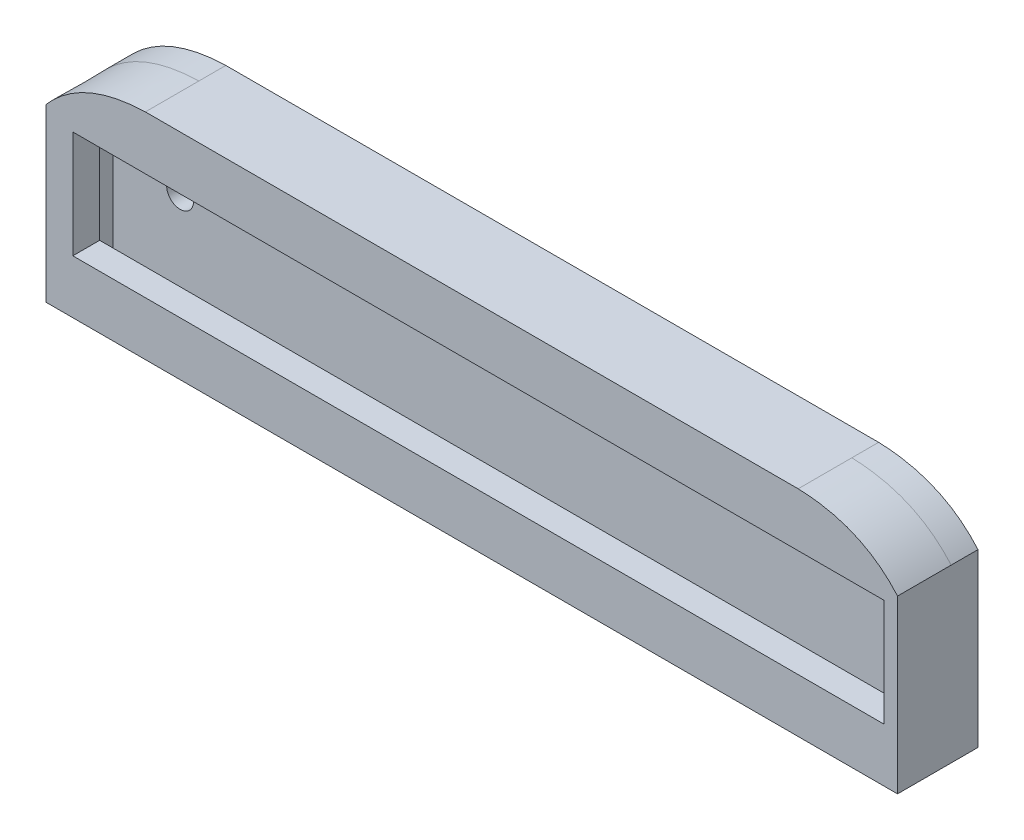
ISO-10303-21;
HEADER;
FILE_DESCRIPTION(('STEP AP214'),'2;1');
FILE_NAME('part.step','',(''),(''),'','','');
FILE_SCHEMA(('AUTOMOTIVE_DESIGN { 1 0 10303 214 1 1 1 1 }'));
ENDSEC;
DATA;
#1=APPLICATION_CONTEXT('core data for automotive mechanical design processes');
#2=APPLICATION_PROTOCOL_DEFINITION('international standard','automotive_design',2000,#1);
#3=PRODUCT_CONTEXT('',#1,'mechanical');
#4=PRODUCT('Part','Part','',(#3));
#5=PRODUCT_RELATED_PRODUCT_CATEGORY('part','',(#4));
#6=PRODUCT_DEFINITION_FORMATION('','',#4);
#7=PRODUCT_DEFINITION_CONTEXT('part definition',#1,'design');
#8=PRODUCT_DEFINITION('design','',#6,#7);
#9=PRODUCT_DEFINITION_SHAPE('','',#8);
#10=(LENGTH_UNIT() NAMED_UNIT(*) SI_UNIT(.MILLI.,.METRE.));
#11=(NAMED_UNIT(*) PLANE_ANGLE_UNIT() SI_UNIT($,.RADIAN.));
#12=(NAMED_UNIT(*) SI_UNIT($,.STERADIAN.) SOLID_ANGLE_UNIT());
#13=UNCERTAINTY_MEASURE_WITH_UNIT(LENGTH_MEASURE(1.E-05),#10,'distance_accuracy_value','');
#14=(GEOMETRIC_REPRESENTATION_CONTEXT(3) GLOBAL_UNCERTAINTY_ASSIGNED_CONTEXT((#13)) GLOBAL_UNIT_ASSIGNED_CONTEXT((#10,
#11,#12)) REPRESENTATION_CONTEXT('',''));
#15=CARTESIAN_POINT('',(0.,0.,0.));
#16=DIRECTION('',(0.,0.,1.));
#17=DIRECTION('',(1.,0.,0.));
#18=AXIS2_PLACEMENT_3D('',#15,#16,#17);
#19=CARTESIAN_POINT('',(31.2499999999999,-8.,2.));
#20=DIRECTION('',(0.,1.,0.));
#21=DIRECTION('',(0.,0.,1.));
#22=AXIS2_PLACEMENT_3D('',#19,#20,#21);
#23=PLANE('',#22);
#24=DIRECTION('',(1.,0.,0.));
#25=VECTOR('',#24,1.);
#26=CARTESIAN_POINT('',(31.2499999999999,-8.,0.));
#27=LINE('',#26,#25);
#28=CARTESIAN_POINT('',(-32.25,-8.,0.));
#29=VERTEX_POINT('',#28);
#30=CARTESIAN_POINT('',(31.2499999999999,-8.,0.));
#31=VERTEX_POINT('',#30);
#32=EDGE_CURVE('E436',#29,#31,#27,.T.);
#33=ORIENTED_EDGE('',*,*,#32,.T.);
#34=DIRECTION('',(0.,0.,-1.));
#35=VECTOR('',#34,1.);
#36=CARTESIAN_POINT('',(31.2499999999999,-8.,2.));
#37=LINE('',#36,#35);
#38=CARTESIAN_POINT('',(31.2499999999999,-8.,6.));
#39=VERTEX_POINT('',#38);
#40=EDGE_CURVE('E11',#39,#31,#37,.T.);
#41=ORIENTED_EDGE('',*,*,#40,.F.);
#42=DIRECTION('',(1.,0.,0.));
#43=VECTOR('',#42,1.);
#44=CARTESIAN_POINT('',(-32.25,-8.,6.));
#45=LINE('',#44,#43);
#46=CARTESIAN_POINT('',(-32.25,-8.,6.));
#47=VERTEX_POINT('',#46);
#48=EDGE_CURVE('E248',#47,#39,#45,.T.);
#49=ORIENTED_EDGE('',*,*,#48,.F.);
#50=DIRECTION('',(0.,0.,-1.));
#51=VECTOR('',#50,1.);
#52=CARTESIAN_POINT('',(-32.25,-8.,2.));
#53=LINE('',#52,#51);
#54=EDGE_CURVE('E438',#47,#29,#53,.T.);
#55=ORIENTED_EDGE('',*,*,#54,.T.);
#56=EDGE_LOOP('',(#33,#41,#49,#55));
#57=FACE_BOUND('',#56,.T.);
#58=ADVANCED_FACE('F41',(#57),#23,.F.);
#59=CARTESIAN_POINT('',(31.2499999999999,4.77723529661171,2.));
#60=DIRECTION('',(-1.,0.,0.));
#61=DIRECTION('',(0.,0.,1.));
#62=AXIS2_PLACEMENT_3D('',#59,#60,#61);
#63=PLANE('',#62);
#64=DIRECTION('',(0.,1.,0.));
#65=VECTOR('',#64,1.);
#66=CARTESIAN_POINT('',(31.2499999999999,4.77723529661171,0.));
#67=LINE('',#66,#65);
#68=CARTESIAN_POINT('',(31.2500000057796,4.77723529010021,0.));
#69=VERTEX_POINT('',#68);
#70=EDGE_CURVE('E440',#31,#69,#67,.T.);
#71=ORIENTED_EDGE('',*,*,#70,.T.);
#72=DIRECTION('',(0.,0.,-1.));
#73=VECTOR('',#72,1.);
#74=CARTESIAN_POINT('',(31.2500000057796,4.77723529010021,2.));
#75=LINE('',#74,#73);
#76=CARTESIAN_POINT('',(31.2500000057796,4.77723529010021,2.));
#77=VERTEX_POINT('',#76);
#78=EDGE_CURVE('E50',#77,#69,#75,.T.);
#79=ORIENTED_EDGE('',*,*,#78,.F.);
#80=DIRECTION('',(0.,0.,-1.));
#81=VECTOR('',#80,1.);
#82=CARTESIAN_POINT('',(31.2500000117157,4.77723528320106,4.));
#83=LINE('',#82,#81);
#84=CARTESIAN_POINT('',(31.2500000117157,4.77723528320106,6.));
#85=VERTEX_POINT('',#84);
#86=EDGE_CURVE('E441',#85,#77,#83,.T.);
#87=ORIENTED_EDGE('',*,*,#86,.F.);
#88=DIRECTION('',(9.01599712585994E-10,1.,0.));
#89=VECTOR('',#88,1.);
#90=CARTESIAN_POINT('',(31.2499999999999,-8.,6.));
#91=LINE('',#90,#89);
#92=EDGE_CURVE('E200',#39,#85,#91,.T.);
#93=ORIENTED_EDGE('',*,*,#92,.F.);
#94=ORIENTED_EDGE('',*,*,#40,.T.);
#95=EDGE_LOOP('',(#71,#79,#87,#93,#94));
#96=FACE_BOUND('',#95,.T.);
#97=ADVANCED_FACE('F427',(#96),#63,.F.);
#98=CARTESIAN_POINT('',(-571793.781585153,-820381.105272652,2.));
#99=CARTESIAN_POINT('',(575267.156620436,817992.669128069,2.));
#100=CARTESIAN_POINT('',(-578622.004023115,-815579.253240357,2.));
#101=B_SPLINE_CURVE_WITH_KNOTS('',2,(#98,#99,#100),.UNSPECIFIED.,.F.,.F.,(3,3),(0.,1.),.UNSPECIFIED.);
#102=DIRECTION('',(0.,0.,-1.));
#103=VECTOR('',#102,1.);
#104=SURFACE_OF_LINEAR_EXTRUSION('',#101,#103);
#105=CARTESIAN_POINT('',(-571793.781585153,-820381.105272652,0.));
#106=CARTESIAN_POINT('',(575267.156620436,817992.669128069,0.));
#107=CARTESIAN_POINT('',(-578622.004023115,-815579.253240357,0.));
#108=B_SPLINE_CURVE_WITH_KNOTS('',2,(#105,#106,#107),.UNSPECIFIED.,.F.,.F.,(3,3),(0.,1.),.UNSPECIFIED.);
#109=CARTESIAN_POINT('',(23.8400578712769,8.00000000000038,0.));
#110=VERTEX_POINT('',#109);
#111=EDGE_CURVE('E443',#69,#110,#108,.T.);
#112=ORIENTED_EDGE('',*,*,#111,.T.);
#113=DIRECTION('',(0.,0.,-1.));
#114=VECTOR('',#113,1.);
#115=CARTESIAN_POINT('',(23.8400578712769,8.00000000000038,2.));
#116=LINE('',#115,#114);
#117=CARTESIAN_POINT('',(23.8400578712769,8.00000000000038,2.));
#118=VERTEX_POINT('',#117);
#119=EDGE_CURVE('E477',#118,#110,#116,.T.);
#120=ORIENTED_EDGE('',*,*,#119,.F.);
#121=EDGE_CURVE('E471',#77,#118,#101,.T.);
#122=ORIENTED_EDGE('',*,*,#121,.F.);
#123=ORIENTED_EDGE('',*,*,#78,.T.);
#124=EDGE_LOOP('',(#112,#120,#122,#123));
#125=FACE_BOUND('',#124,.T.);
#126=ADVANCED_FACE('F433',(#125),#104,.F.);
#127=CARTESIAN_POINT('',(23.8400578712769,8.00000000000038,2.));
#128=DIRECTION('',(0.,-1.,0.));
#129=DIRECTION('',(1.,0.,0.));
#130=AXIS2_PLACEMENT_3D('',#127,#128,#129);
#131=PLANE('',#130);
#132=DIRECTION('',(-1.,0.,0.));
#133=VECTOR('',#132,1.);
#134=CARTESIAN_POINT('',(23.8400578712769,8.00000000000038,0.));
#135=LINE('',#134,#133);
#136=CARTESIAN_POINT('',(-24.840057871802,8.00000000012277,0.));
#137=VERTEX_POINT('',#136);
#138=EDGE_CURVE('E458',#110,#137,#135,.T.);
#139=ORIENTED_EDGE('',*,*,#138,.T.);
#140=DIRECTION('',(0.,0.,-1.));
#141=VECTOR('',#140,1.);
#142=CARTESIAN_POINT('',(-24.840057871802,8.00000000012277,2.));
#143=LINE('',#142,#141);
#144=CARTESIAN_POINT('',(-24.840057871802,8.00000000012277,2.));
#145=VERTEX_POINT('',#144);
#146=EDGE_CURVE('E474',#145,#137,#143,.T.);
#147=ORIENTED_EDGE('',*,*,#146,.F.);
#148=DIRECTION('',(0.,0.,-1.));
#149=VECTOR('',#148,1.);
#150=CARTESIAN_POINT('',(-24.8400578601347,8.00000000052837,4.));
#151=LINE('',#150,#149);
#152=CARTESIAN_POINT('',(-24.8400578601347,8.00000000052837,6.));
#153=VERTEX_POINT('',#152);
#154=EDGE_CURVE('E699',#153,#145,#151,.T.);
#155=ORIENTED_EDGE('',*,*,#154,.F.);
#156=DIRECTION('',(-1.,9.611478407392E-12,0.));
#157=VECTOR('',#156,1.);
#158=CARTESIAN_POINT('',(23.8400578712769,8.00000000000038,6.));
#159=LINE('',#158,#157);
#160=CARTESIAN_POINT('',(23.8400578712769,8.00000000000038,6.));
#161=VERTEX_POINT('',#160);
#162=EDGE_CURVE('E231',#161,#153,#159,.T.);
#163=ORIENTED_EDGE('',*,*,#162,.F.);
#164=DIRECTION('',(0.,0.,-1.));
#165=VECTOR('',#164,1.);
#166=CARTESIAN_POINT('',(23.8400578712769,8.00000000000038,4.));
#167=LINE('',#166,#165);
#168=EDGE_CURVE('E446',#161,#118,#167,.T.);
#169=ORIENTED_EDGE('',*,*,#168,.T.);
#170=ORIENTED_EDGE('',*,*,#119,.T.);
#171=EDGE_LOOP('',(#139,#147,#155,#163,#169,#170));
#172=FACE_BOUND('',#171,.T.);
#173=ADVANCED_FACE('F611',(#172),#131,.F.);
#174=CARTESIAN_POINT('',(578621.004023114,-815579.253240357,2.));
#175=CARTESIAN_POINT('',(-575268.156620436,817992.669128069,2.));
#176=CARTESIAN_POINT('',(571792.781585153,-820381.105272652,2.));
#177=B_SPLINE_CURVE_WITH_KNOTS('',2,(#174,#175,#176),.UNSPECIFIED.,.F.,.F.,(3,3),(0.,1.),.UNSPECIFIED.);
#178=DIRECTION('',(0.,0.,-1.));
#179=VECTOR('',#178,1.);
#180=SURFACE_OF_LINEAR_EXTRUSION('',#177,#179);
#181=CARTESIAN_POINT('',(578621.004023114,-815579.253240357,0.));
#182=CARTESIAN_POINT('',(-575268.156620436,817992.669128069,0.));
#183=CARTESIAN_POINT('',(571792.781585153,-820381.105272652,0.));
#184=B_SPLINE_CURVE_WITH_KNOTS('',2,(#181,#182,#183),.UNSPECIFIED.,.F.,.F.,(3,3),(0.,1.),.UNSPECIFIED.);
#185=CARTESIAN_POINT('',(-32.25,4.77723529661171,0.));
#186=VERTEX_POINT('',#185);
#187=EDGE_CURVE('E463',#137,#186,#184,.T.);
#188=ORIENTED_EDGE('',*,*,#187,.T.);
#189=DIRECTION('',(0.,0.,-1.));
#190=VECTOR('',#189,1.);
#191=CARTESIAN_POINT('',(-32.25,4.77723529661171,2.));
#192=LINE('',#191,#190);
#193=CARTESIAN_POINT('',(-32.25,4.77723529661171,2.));
#194=VERTEX_POINT('',#193);
#195=EDGE_CURVE('E68',#194,#186,#192,.T.);
#196=ORIENTED_EDGE('',*,*,#195,.F.);
#197=EDGE_CURVE('E449',#145,#194,#177,.T.);
#198=ORIENTED_EDGE('',*,*,#197,.F.);
#199=ORIENTED_EDGE('',*,*,#146,.T.);
#200=EDGE_LOOP('',(#188,#196,#198,#199));
#201=FACE_BOUND('',#200,.T.);
#202=ADVANCED_FACE('F616',(#201),#180,.F.);
#203=CARTESIAN_POINT('',(-32.25,-8.,2.));
#204=DIRECTION('',(1.,0.,0.));
#205=DIRECTION('',(0.,1.,0.));
#206=AXIS2_PLACEMENT_3D('',#203,#204,#205);
#207=PLANE('',#206);
#208=DIRECTION('',(0.,-1.,0.));
#209=VECTOR('',#208,1.);
#210=CARTESIAN_POINT('',(-32.25,-8.,0.));
#211=LINE('',#210,#209);
#212=EDGE_CURVE('E95',#186,#29,#211,.T.);
#213=ORIENTED_EDGE('',*,*,#212,.T.);
#214=ORIENTED_EDGE('',*,*,#54,.F.);
#215=DIRECTION('',(0.,-1.,0.));
#216=VECTOR('',#215,1.);
#217=CARTESIAN_POINT('',(-32.25,4.77723529661171,6.));
#218=LINE('',#217,#216);
#219=CARTESIAN_POINT('',(-32.25,4.77723529661171,6.));
#220=VERTEX_POINT('',#219);
#221=EDGE_CURVE('E242',#220,#47,#218,.T.);
#222=ORIENTED_EDGE('',*,*,#221,.F.);
#223=DIRECTION('',(0.,0.,-1.));
#224=VECTOR('',#223,1.);
#225=CARTESIAN_POINT('',(-32.25,4.77723529661171,4.));
#226=LINE('',#225,#224);
#227=EDGE_CURVE('E484',#220,#194,#226,.T.);
#228=ORIENTED_EDGE('',*,*,#227,.T.);
#229=ORIENTED_EDGE('',*,*,#195,.T.);
#230=EDGE_LOOP('',(#213,#214,#222,#228,#229));
#231=FACE_BOUND('',#230,.T.);
#232=ADVANCED_FACE('F577',(#231),#207,.F.);
#233=CARTESIAN_POINT('',(-30.6319081510935,6.24493578231977,0.));
#234=DIRECTION('',(0.,0.,-1.));
#235=DIRECTION('',(-1.,0.,0.));
#236=AXIS2_PLACEMENT_3D('',#233,#234,#235);
#237=PLANE('',#236);
#238=ORIENTED_EDGE('',*,*,#32,.F.);
#239=ORIENTED_EDGE('',*,*,#212,.F.);
#240=ORIENTED_EDGE('',*,*,#187,.F.);
#241=ORIENTED_EDGE('',*,*,#138,.F.);
#242=ORIENTED_EDGE('',*,*,#111,.F.);
#243=ORIENTED_EDGE('',*,*,#70,.F.);
#244=EDGE_LOOP('',(#238,#239,#240,#241,#242,#243));
#245=FACE_BOUND('',#244,.T.);
#246=ADVANCED_FACE('F349',(#245),#237,.T.);
#247=CARTESIAN_POINT('',(-571793.781585169,-820381.10527264,4.));
#248=CARTESIAN_POINT('',(575267.156620435,817992.669128069,4.));
#249=CARTESIAN_POINT('',(-578622.004023096,-815579.253240369,4.));
#250=B_SPLINE_CURVE_WITH_KNOTS('',2,(#247,#248,#249),.UNSPECIFIED.,.F.,.F.,(3,3),(0.,1.),.UNSPECIFIED.);
#251=DIRECTION('',(0.,0.,-1.));
#252=VECTOR('',#251,1.);
#253=SURFACE_OF_LINEAR_EXTRUSION('',#250,#252);
#254=ORIENTED_EDGE('',*,*,#121,.T.);
#255=ORIENTED_EDGE('',*,*,#168,.F.);
#256=CARTESIAN_POINT('',(-571793.781585169,-820381.10527264,6.));
#257=CARTESIAN_POINT('',(575267.156620435,817992.669128069,6.));
#258=CARTESIAN_POINT('',(-578622.004023096,-815579.253240369,6.));
#259=B_SPLINE_CURVE_WITH_KNOTS('',2,(#256,#257,#258),.UNSPECIFIED.,.F.,.F.,(3,3),(0.,1.),.UNSPECIFIED.);
#260=EDGE_CURVE('E226',#85,#161,#259,.T.);
#261=ORIENTED_EDGE('',*,*,#260,.F.);
#262=ORIENTED_EDGE('',*,*,#86,.T.);
#263=EDGE_LOOP('',(#254,#255,#261,#262));
#264=FACE_BOUND('',#263,.T.);
#265=ADVANCED_FACE('F345',(#264),#253,.F.);
#266=CARTESIAN_POINT('',(578621.004023118,-815579.253240354,4.));
#267=CARTESIAN_POINT('',(-575268.156620435,817992.66912807,4.));
#268=CARTESIAN_POINT('',(571792.781585148,-820381.105272656,4.));
#269=B_SPLINE_CURVE_WITH_KNOTS('',2,(#266,#267,#268),.UNSPECIFIED.,.F.,.F.,(3,3),(0.,1.),.UNSPECIFIED.);
#270=DIRECTION('',(0.,0.,-1.));
#271=VECTOR('',#270,1.);
#272=SURFACE_OF_LINEAR_EXTRUSION('',#269,#271);
#273=ORIENTED_EDGE('',*,*,#197,.T.);
#274=ORIENTED_EDGE('',*,*,#227,.F.);
#275=CARTESIAN_POINT('',(578621.004023118,-815579.253240354,6.));
#276=CARTESIAN_POINT('',(-575268.156620435,817992.66912807,6.));
#277=CARTESIAN_POINT('',(571792.781585148,-820381.105272656,6.));
#278=B_SPLINE_CURVE_WITH_KNOTS('',2,(#275,#276,#277),.UNSPECIFIED.,.F.,.F.,(3,3),(0.,1.),.UNSPECIFIED.);
#279=EDGE_CURVE('E237',#153,#220,#278,.T.);
#280=ORIENTED_EDGE('',*,*,#279,.F.);
#281=ORIENTED_EDGE('',*,*,#154,.T.);
#282=EDGE_LOOP('',(#273,#274,#280,#281));
#283=FACE_BOUND('',#282,.T.);
#284=ADVANCED_FACE('F271',(#283),#272,.F.);
#285=CARTESIAN_POINT('',(29.6319081513445,6.2449357820924,4.));
#286=DIRECTION('',(0.,0.,-1.));
#287=DIRECTION('',(-1.,0.,0.));
#288=AXIS2_PLACEMENT_3D('',#285,#286,#287);
#289=PLANE('',#288);
#290=DIRECTION('',(4.51279717190175E-10,1.,0.));
#291=VECTOR('',#290,1.);
#292=CARTESIAN_POINT('',(30.2500000004523,-7.,4.));
#293=LINE('',#292,#291);
#294=CARTESIAN_POINT('',(30.25,4.,4.));
#295=VERTEX_POINT('',#294);
#296=CARTESIAN_POINT('',(30.2500000055934,4.39227540127021,4.));
#297=VERTEX_POINT('',#296);
#298=EDGE_CURVE('E44',#295,#297,#293,.T.);
#299=ORIENTED_EDGE('',*,*,#298,.F.);
#300=DIRECTION('',(-1.,0.,0.));
#301=VECTOR('',#300,1.);
#302=CARTESIAN_POINT('',(-30.25,4.,4.));
#303=LINE('',#302,#301);
#304=CARTESIAN_POINT('',(-30.25,4.,4.));
#305=VERTEX_POINT('',#304);
#306=EDGE_CURVE('E199',#295,#305,#303,.T.);
#307=ORIENTED_EDGE('',*,*,#306,.T.);
#308=DIRECTION('',(0.,-1.,0.));
#309=VECTOR('',#308,1.);
#310=CARTESIAN_POINT('',(-30.25,4.,4.));
#311=LINE('',#310,#309);
#312=CARTESIAN_POINT('',(-30.25,-4.,4.));
#313=VERTEX_POINT('',#312);
#314=EDGE_CURVE('E214',#305,#313,#311,.T.);
#315=ORIENTED_EDGE('',*,*,#314,.T.);
#316=DIRECTION('',(1.,0.,0.));
#317=VECTOR('',#316,1.);
#318=CARTESIAN_POINT('',(-30.25,-4.,4.));
#319=LINE('',#318,#317);
#320=CARTESIAN_POINT('',(30.25,-4.,4.));
#321=VERTEX_POINT('',#320);
#322=EDGE_CURVE('E192',#313,#321,#319,.T.);
#323=ORIENTED_EDGE('',*,*,#322,.T.);
#324=CARTESIAN_POINT('',(30.2500000004523,-7.,4.));
#325=VERTEX_POINT('',#324);
#326=EDGE_CURVE('E398',#325,#321,#293,.T.);
#327=ORIENTED_EDGE('',*,*,#326,.F.);
#328=DIRECTION('',(1.,0.,0.));
#329=VECTOR('',#328,1.);
#330=CARTESIAN_POINT('',(-31.25,-7.,4.));
#331=LINE('',#330,#329);
#332=CARTESIAN_POINT('',(-31.25,-7.,4.));
#333=VERTEX_POINT('',#332);
#334=EDGE_CURVE('E281',#333,#325,#331,.T.);
#335=ORIENTED_EDGE('',*,*,#334,.F.);
#336=DIRECTION('',(4.42806699095042E-13,-1.,0.));
#337=VECTOR('',#336,1.);
#338=CARTESIAN_POINT('',(-31.2500000000051,4.39227540696672,4.));
#339=LINE('',#338,#337);
#340=CARTESIAN_POINT('',(-31.2500000000051,4.39227540698845,4.));
#341=VERTEX_POINT('',#340);
#342=EDGE_CURVE('E289',#341,#333,#339,.T.);
#343=ORIENTED_EDGE('',*,*,#342,.F.);
#344=CARTESIAN_POINT('',(-24.8249771858814,7.00000000011821,4.));
#345=CARTESIAN_POINT('',(-25.4217733241779,6.981678603532,4.));
#346=CARTESIAN_POINT('',(-26.0107659863602,6.92552313505378,4.));
#347=CARTESIAN_POINT('',(-27.1692622357925,6.71872212076852,4.));
#348=CARTESIAN_POINT('',(-27.738796388203,6.56822476600044,4.));
#349=CARTESIAN_POINT('',(-28.5741972723409,6.25084303428421,4.));
#350=CARTESIAN_POINT('',(-28.8504343211443,6.12895654016291,4.));
#351=CARTESIAN_POINT('',(-29.3810682713078,5.85812644396728,4.));
#352=CARTESIAN_POINT('',(-29.893359619396,5.55916996147399,4.));
#353=CARTESIAN_POINT('',(-30.3683829872768,5.20306708244348,4.));
#354=CARTESIAN_POINT('',(-30.824570303522,4.81808116583715,4.));
#355=CARTESIAN_POINT('',(-31.0435072707871,4.61068102907416,4.));
#356=CARTESIAN_POINT('',(-31.2500000000087,4.39227540698845,4.));
#357=B_SPLINE_CURVE_WITH_KNOTS('',3,(#344,#345,#346,#347,#348,#349,#350,#351,#352,#353,#354,
#355,#356),.UNSPECIFIED.,.F.,.F.,(4,2,2,2,1,2,4),(0.,0.249999999999999,0.499999999999999,
0.624999999999999,0.749999999999999,0.875,1.),.UNSPECIFIED.);
#358=CARTESIAN_POINT('',(-24.8249771858814,7.00000000011821,4.));
#359=VERTEX_POINT('',#358);
#360=EDGE_CURVE('E255',#359,#341,#357,.T.);
#361=ORIENTED_EDGE('',*,*,#360,.F.);
#362=DIRECTION('',(-1.,2.32408592244184E-12,0.));
#363=VECTOR('',#362,1.);
#364=CARTESIAN_POINT('',(23.8249771842044,7.00000000000514,4.));
#365=LINE('',#364,#363);
#366=CARTESIAN_POINT('',(23.82497718422,7.00000000000514,4.));
#367=VERTEX_POINT('',#366);
#368=EDGE_CURVE('E397',#367,#359,#365,.T.);
#369=ORIENTED_EDGE('',*,*,#368,.F.);
#370=CARTESIAN_POINT('',(30.2500000055934,4.39227540127021,4.));
#371=CARTESIAN_POINT('',(29.8389362928899,4.82705403195299,4.));
#372=CARTESIAN_POINT('',(29.3882892724057,5.20888593390855,4.));
#373=CARTESIAN_POINT('',(28.4056236868693,5.863706961995,4.));
#374=CARTESIAN_POINT('',(27.8676484858788,6.13783307632347,4.));
#375=CARTESIAN_POINT('',(26.7616644021415,6.56100893331187,4.));
#376=CARTESIAN_POINT('',(26.1898430527651,6.71431590687129,4.));
#377=CARTESIAN_POINT('',(25.0153440918239,6.92542276069161,4.));
#378=CARTESIAN_POINT('',(24.4216355214583,6.98168283395071,4.));
#379=CARTESIAN_POINT('',(23.82497718422,7.00000000001072,4.));
#380=B_SPLINE_CURVE_WITH_KNOTS('',3,(#370,#371,#372,#373,#374,#375,#376,#377,#378,#379),
.UNSPECIFIED.,.F.,.F.,(4,2,2,2,4),(0.,0.25,0.5,0.75,1.),.UNSPECIFIED.);
#381=EDGE_CURVE('E393',#297,#367,#380,.T.);
#382=ORIENTED_EDGE('',*,*,#381,.F.);
#383=EDGE_LOOP('',(#299,#307,#315,#323,#327,#335,#343,#361,#369,#382));
#384=FACE_BOUND('',#383,.T.);
#385=ADVANCED_FACE('F261',(#384),#289,.T.);
#386=CARTESIAN_POINT('',(29.6319081513445,6.2449357820924,6.));
#387=DIRECTION('',(0.,0.,-1.));
#388=DIRECTION('',(-1.,0.,0.));
#389=AXIS2_PLACEMENT_3D('',#386,#387,#388);
#390=PLANE('',#389);
#391=ORIENTED_EDGE('',*,*,#92,.T.);
#392=ORIENTED_EDGE('',*,*,#260,.T.);
#393=ORIENTED_EDGE('',*,*,#162,.T.);
#394=ORIENTED_EDGE('',*,*,#279,.T.);
#395=ORIENTED_EDGE('',*,*,#221,.T.);
#396=ORIENTED_EDGE('',*,*,#48,.T.);
#397=EDGE_LOOP('',(#391,#392,#393,#394,#395,#396));
#398=FACE_BOUND('',#397,.T.);
#399=DIRECTION('',(0.,1.,0.));
#400=VECTOR('',#399,1.);
#401=CARTESIAN_POINT('',(30.25,4.,6.));
#402=LINE('',#401,#400);
#403=CARTESIAN_POINT('',(30.25,-4.,6.));
#404=VERTEX_POINT('',#403);
#405=CARTESIAN_POINT('',(30.25,4.,6.));
#406=VERTEX_POINT('',#405);
#407=EDGE_CURVE('E180',#404,#406,#402,.T.);
#408=ORIENTED_EDGE('',*,*,#407,.F.);
#409=DIRECTION('',(1.,0.,0.));
#410=VECTOR('',#409,1.);
#411=CARTESIAN_POINT('',(-30.25,-4.,6.));
#412=LINE('',#411,#410);
#413=CARTESIAN_POINT('',(-30.25,-4.,6.));
#414=VERTEX_POINT('',#413);
#415=EDGE_CURVE('E208',#414,#404,#412,.T.);
#416=ORIENTED_EDGE('',*,*,#415,.F.);
#417=DIRECTION('',(0.,-1.,0.));
#418=VECTOR('',#417,1.);
#419=CARTESIAN_POINT('',(-30.25,4.,6.));
#420=LINE('',#419,#418);
#421=CARTESIAN_POINT('',(-30.25,4.,6.));
#422=VERTEX_POINT('',#421);
#423=EDGE_CURVE('E206',#422,#414,#420,.T.);
#424=ORIENTED_EDGE('',*,*,#423,.F.);
#425=DIRECTION('',(-1.,0.,0.));
#426=VECTOR('',#425,1.);
#427=CARTESIAN_POINT('',(-30.25,4.,6.));
#428=LINE('',#427,#426);
#429=EDGE_CURVE('E191',#406,#422,#428,.T.);
#430=ORIENTED_EDGE('',*,*,#429,.F.);
#431=EDGE_LOOP('',(#408,#416,#424,#430));
#432=FACE_BOUND('',#431,.T.);
#433=ADVANCED_FACE('F204',(#398,#432),#390,.F.);
#434=CARTESIAN_POINT('',(-30.25,4.,6.));
#435=DIRECTION('',(0.,-1.,0.));
#436=DIRECTION('',(0.,0.,-1.));
#437=AXIS2_PLACEMENT_3D('',#434,#435,#436);
#438=PLANE('',#437);
#439=ORIENTED_EDGE('',*,*,#306,.F.);
#440=DIRECTION('',(0.,0.,-1.));
#441=VECTOR('',#440,1.);
#442=CARTESIAN_POINT('',(30.25,4.,6.));
#443=LINE('',#442,#441);
#444=EDGE_CURVE('E185',#406,#295,#443,.T.);
#445=ORIENTED_EDGE('',*,*,#444,.F.);
#446=ORIENTED_EDGE('',*,*,#429,.T.);
#447=DIRECTION('',(0.,0.,-1.));
#448=VECTOR('',#447,1.);
#449=CARTESIAN_POINT('',(-30.25,4.,6.));
#450=LINE('',#449,#448);
#451=EDGE_CURVE('E201',#422,#305,#450,.T.);
#452=ORIENTED_EDGE('',*,*,#451,.T.);
#453=EDGE_LOOP('',(#439,#445,#446,#452));
#454=FACE_BOUND('',#453,.T.);
#455=ADVANCED_FACE('F196',(#454),#438,.T.);
#456=CARTESIAN_POINT('',(-30.25,4.,6.));
#457=DIRECTION('',(1.,0.,0.));
#458=DIRECTION('',(0.,0.,-1.));
#459=AXIS2_PLACEMENT_3D('',#456,#457,#458);
#460=PLANE('',#459);
#461=ORIENTED_EDGE('',*,*,#314,.F.);
#462=ORIENTED_EDGE('',*,*,#451,.F.);
#463=ORIENTED_EDGE('',*,*,#423,.T.);
#464=DIRECTION('',(0.,0.,-1.));
#465=VECTOR('',#464,1.);
#466=CARTESIAN_POINT('',(-30.25,-4.,6.));
#467=LINE('',#466,#465);
#468=EDGE_CURVE('E221',#414,#313,#467,.T.);
#469=ORIENTED_EDGE('',*,*,#468,.T.);
#470=EDGE_LOOP('',(#461,#462,#463,#469));
#471=FACE_BOUND('',#470,.T.);
#472=ADVANCED_FACE('F416',(#471),#460,.T.);
#473=CARTESIAN_POINT('',(-30.25,-4.,6.));
#474=DIRECTION('',(0.,1.,0.));
#475=DIRECTION('',(0.,0.,1.));
#476=AXIS2_PLACEMENT_3D('',#473,#474,#475);
#477=PLANE('',#476);
#478=ORIENTED_EDGE('',*,*,#322,.F.);
#479=ORIENTED_EDGE('',*,*,#468,.F.);
#480=ORIENTED_EDGE('',*,*,#415,.T.);
#481=DIRECTION('',(0.,0.,-1.));
#482=VECTOR('',#481,1.);
#483=CARTESIAN_POINT('',(30.25,-4.,6.));
#484=LINE('',#483,#482);
#485=EDGE_CURVE('E187',#404,#321,#484,.T.);
#486=ORIENTED_EDGE('',*,*,#485,.T.);
#487=EDGE_LOOP('',(#478,#479,#480,#486));
#488=FACE_BOUND('',#487,.T.);
#489=ADVANCED_FACE('F357',(#488),#477,.T.);
#490=CARTESIAN_POINT('',(-30.6319081510935,6.24493578231977,2.));
#491=DIRECTION('',(0.,0.,-1.));
#492=DIRECTION('',(-1.,0.,0.));
#493=AXIS2_PLACEMENT_3D('',#490,#491,#492);
#494=PLANE('',#493);
#495=CARTESIAN_POINT('',(-26.25,0.,2.));
#496=DIRECTION('',(0.,0.,1.));
#497=DIRECTION('',(1.,0.,0.));
#498=AXIS2_PLACEMENT_3D('',#495,#496,#497);
#499=CIRCLE('',#498,1.);
#500=CARTESIAN_POINT('',(-25.25,0.,2.));
#501=VERTEX_POINT('',#500);
#502=EDGE_CURVE('E562',#501,#501,#499,.T.);
#503=ORIENTED_EDGE('',*,*,#502,.F.);
#504=EDGE_LOOP('',(#503));
#505=FACE_BOUND('',#504,.T.);
#506=DIRECTION('',(-1.,2.32408592244184E-12,0.));
#507=VECTOR('',#506,1.);
#508=CARTESIAN_POINT('',(23.8249771842044,7.00000000000514,2.));
#509=LINE('',#508,#507);
#510=CARTESIAN_POINT('',(23.82497718422,7.00000000001072,2.));
#511=VERTEX_POINT('',#510);
#512=CARTESIAN_POINT('',(-24.8249771858814,7.00000000011821,2.));
#513=VERTEX_POINT('',#512);
#514=EDGE_CURVE('E379',#511,#513,#509,.T.);
#515=ORIENTED_EDGE('',*,*,#514,.T.);
#516=CARTESIAN_POINT('',(-31.2500000000087,4.39227540698845,2.));
#517=CARTESIAN_POINT('',(-31.0435072707871,4.61068102907416,2.));
#518=CARTESIAN_POINT('',(-30.824570303522,4.81808116583715,2.));
#519=CARTESIAN_POINT('',(-30.3683829872768,5.20306708244348,2.));
#520=CARTESIAN_POINT('',(-29.893359619396,5.55916996147399,2.));
#521=CARTESIAN_POINT('',(-29.3810682713078,5.85812644396728,2.));
#522=CARTESIAN_POINT('',(-28.8504343211443,6.12895654016291,2.));
#523=CARTESIAN_POINT('',(-28.5741972723409,6.25084303428421,2.));
#524=CARTESIAN_POINT('',(-27.738796388203,6.56822476600044,2.));
#525=CARTESIAN_POINT('',(-27.1692622357925,6.71872212076852,2.));
#526=CARTESIAN_POINT('',(-26.0107659863602,6.92552313505378,2.));
#527=CARTESIAN_POINT('',(-25.4217733241779,6.981678603532,2.));
#528=CARTESIAN_POINT('',(-24.8249771858814,7.00000000011821,2.));
#529=B_SPLINE_CURVE_WITH_KNOTS('',3,(#516,#517,#518,#519,#520,#521,#522,#523,#524,#525,#526,
#527,#528),.UNSPECIFIED.,.F.,.F.,(4,2,1,2,2,2,4),(0.,0.125,0.250000000000001,0.375000000000001,
0.500000000000001,0.750000000000001,1.),.UNSPECIFIED.);
#530=CARTESIAN_POINT('',(-31.2500000000087,4.39227540698845,2.));
#531=VERTEX_POINT('',#530);
#532=EDGE_CURVE('E58',#513,#531,#529,.F.);
#533=ORIENTED_EDGE('',*,*,#532,.T.);
#534=DIRECTION('',(4.42806699095042E-13,-1.,0.));
#535=VECTOR('',#534,1.);
#536=CARTESIAN_POINT('',(-31.2500000000051,4.39227540696672,2.));
#537=LINE('',#536,#535);
#538=CARTESIAN_POINT('',(-31.25,-7.,2.));
#539=VERTEX_POINT('',#538);
#540=EDGE_CURVE('E251',#531,#539,#537,.T.);
#541=ORIENTED_EDGE('',*,*,#540,.T.);
#542=DIRECTION('',(1.,0.,0.));
#543=VECTOR('',#542,1.);
#544=CARTESIAN_POINT('',(-31.25,-7.,2.));
#545=LINE('',#544,#543);
#546=CARTESIAN_POINT('',(30.2500000004523,-7.,2.));
#547=VERTEX_POINT('',#546);
#548=EDGE_CURVE('E330',#539,#547,#545,.T.);
#549=ORIENTED_EDGE('',*,*,#548,.T.);
#550=DIRECTION('',(4.51279717190175E-10,1.,0.));
#551=VECTOR('',#550,1.);
#552=CARTESIAN_POINT('',(30.2500000004523,-7.,2.));
#553=LINE('',#552,#551);
#554=CARTESIAN_POINT('',(30.2500000055934,4.39227540127021,2.));
#555=VERTEX_POINT('',#554);
#556=EDGE_CURVE('E321',#547,#555,#553,.T.);
#557=ORIENTED_EDGE('',*,*,#556,.T.);
#558=CARTESIAN_POINT('',(23.82497718422,7.00000000001072,2.));
#559=CARTESIAN_POINT('',(24.4216355214583,6.98168283395071,2.));
#560=CARTESIAN_POINT('',(25.0153440918239,6.92542276069161,2.));
#561=CARTESIAN_POINT('',(26.1898430527651,6.71431590687129,2.));
#562=CARTESIAN_POINT('',(26.7616644021415,6.56100893331187,2.));
#563=CARTESIAN_POINT('',(27.8676484858788,6.13783307632347,2.));
#564=CARTESIAN_POINT('',(28.4056236868693,5.863706961995,2.));
#565=CARTESIAN_POINT('',(29.3882892724057,5.20888593390855,2.));
#566=CARTESIAN_POINT('',(29.8389362928899,4.82705403195299,2.));
#567=CARTESIAN_POINT('',(30.2500000055934,4.39227540127021,2.));
#568=B_SPLINE_CURVE_WITH_KNOTS('',3,(#558,#559,#560,#561,#562,#563,#564,#565,#566,#567),
.UNSPECIFIED.,.F.,.F.,(4,2,2,2,4),(0.,0.25,0.5,0.75,1.),.UNSPECIFIED.);
#569=EDGE_CURVE('E329',#555,#511,#568,.F.);
#570=ORIENTED_EDGE('',*,*,#569,.T.);
#571=EDGE_LOOP('',(#515,#533,#541,#549,#557,#570));
#572=FACE_BOUND('',#571,.T.);
#573=ADVANCED_FACE('F352',(#505,#572),#494,.F.);
#574=CARTESIAN_POINT('',(-31.25,-7.,4.));
#575=DIRECTION('',(0.,1.,0.));
#576=DIRECTION('',(0.,0.,1.));
#577=AXIS2_PLACEMENT_3D('',#574,#575,#576);
#578=PLANE('',#577);
#579=ORIENTED_EDGE('',*,*,#548,.F.);
#580=DIRECTION('',(0.,0.,-1.));
#581=VECTOR('',#580,1.);
#582=CARTESIAN_POINT('',(-31.25,-7.,4.));
#583=LINE('',#582,#581);
#584=EDGE_CURVE('E481',#333,#539,#583,.T.);
#585=ORIENTED_EDGE('',*,*,#584,.F.);
#586=ORIENTED_EDGE('',*,*,#334,.T.);
#587=DIRECTION('',(0.,0.,-1.));
#588=VECTOR('',#587,1.);
#589=CARTESIAN_POINT('',(30.2500000004523,-7.,4.));
#590=LINE('',#589,#588);
#591=EDGE_CURVE('E403',#325,#547,#590,.T.);
#592=ORIENTED_EDGE('',*,*,#591,.T.);
#593=EDGE_LOOP('',(#579,#585,#586,#592));
#594=FACE_BOUND('',#593,.T.);
#595=ADVANCED_FACE('F356',(#594),#578,.T.);
#596=CARTESIAN_POINT('',(30.2500000004523,-7.,4.));
#597=DIRECTION('',(-1.,4.51279717190175E-10,0.));
#598=DIRECTION('',(-4.51279717190175E-10,-1.,0.));
#599=AXIS2_PLACEMENT_3D('',#596,#597,#598);
#600=PLANE('',#599);
#601=ORIENTED_EDGE('',*,*,#556,.F.);
#602=ORIENTED_EDGE('',*,*,#591,.F.);
#603=ORIENTED_EDGE('',*,*,#326,.T.);
#604=ORIENTED_EDGE('',*,*,#485,.F.);
#605=ORIENTED_EDGE('',*,*,#407,.T.);
#606=ORIENTED_EDGE('',*,*,#444,.T.);
#607=ORIENTED_EDGE('',*,*,#298,.T.);
#608=DIRECTION('',(0.,0.,-1.));
#609=VECTOR('',#608,1.);
#610=CARTESIAN_POINT('',(30.2500000055934,4.39227540127021,4.));
#611=LINE('',#610,#609);
#612=EDGE_CURVE('E396',#297,#555,#611,.T.);
#613=ORIENTED_EDGE('',*,*,#612,.T.);
#614=EDGE_LOOP('',(#601,#602,#603,#604,#605,#606,#607,#613));
#615=FACE_BOUND('',#614,.T.);
#616=ADVANCED_FACE('F183',(#615),#600,.T.);
#617=CARTESIAN_POINT('',(30.2500000055934,4.39227540127021,4.));
#618=CARTESIAN_POINT('',(29.8389362928899,4.82705403195299,4.));
#619=CARTESIAN_POINT('',(29.3882892724057,5.20888593390855,4.));
#620=CARTESIAN_POINT('',(28.4056236868693,5.863706961995,4.));
#621=CARTESIAN_POINT('',(27.8676484858788,6.13783307632347,4.));
#622=CARTESIAN_POINT('',(26.7616644021415,6.56100893331187,4.));
#623=CARTESIAN_POINT('',(26.1898430527651,6.71431590687129,4.));
#624=CARTESIAN_POINT('',(25.0153440918239,6.92542276069161,4.));
#625=CARTESIAN_POINT('',(24.4216355214583,6.98168283395071,4.));
#626=CARTESIAN_POINT('',(23.82497718422,7.00000000001072,4.));
#627=B_SPLINE_CURVE_WITH_KNOTS('',3,(#617,#618,#619,#620,#621,#622,#623,#624,#625,#626),
.UNSPECIFIED.,.F.,.F.,(4,2,2,2,4),(0.,0.25,0.5,0.75,1.),.UNSPECIFIED.);
#628=DIRECTION('',(0.,0.,-1.));
#629=VECTOR('',#628,1.);
#630=SURFACE_OF_LINEAR_EXTRUSION('',#627,#629);
#631=ORIENTED_EDGE('',*,*,#569,.F.);
#632=ORIENTED_EDGE('',*,*,#612,.F.);
#633=ORIENTED_EDGE('',*,*,#381,.T.);
#634=DIRECTION('',(0.,0.,-1.));
#635=VECTOR('',#634,1.);
#636=CARTESIAN_POINT('',(23.82497718422,7.00000000001072,4.));
#637=LINE('',#636,#635);
#638=EDGE_CURVE('E395',#367,#511,#637,.T.);
#639=ORIENTED_EDGE('',*,*,#638,.T.);
#640=EDGE_LOOP('',(#631,#632,#633,#639));
#641=FACE_BOUND('',#640,.T.);
#642=ADVANCED_FACE('F301',(#641),#630,.T.);
#643=CARTESIAN_POINT('',(23.8249771842044,7.00000000000514,4.));
#644=DIRECTION('',(-2.32408592244184E-12,-1.,0.));
#645=DIRECTION('',(1.,-2.32408592244184E-12,0.));
#646=AXIS2_PLACEMENT_3D('',#643,#644,#645);
#647=PLANE('',#646);
#648=ORIENTED_EDGE('',*,*,#514,.F.);
#649=ORIENTED_EDGE('',*,*,#638,.F.);
#650=ORIENTED_EDGE('',*,*,#368,.T.);
#651=DIRECTION('',(0.,0.,-1.));
#652=VECTOR('',#651,1.);
#653=CARTESIAN_POINT('',(-24.8249771858814,7.00000000011821,4.));
#654=LINE('',#653,#652);
#655=EDGE_CURVE('E401',#359,#513,#654,.T.);
#656=ORIENTED_EDGE('',*,*,#655,.T.);
#657=EDGE_LOOP('',(#648,#649,#650,#656));
#658=FACE_BOUND('',#657,.T.);
#659=ADVANCED_FACE('F305',(#658),#647,.T.);
#660=CARTESIAN_POINT('',(-24.8249771858814,7.00000000011821,4.));
#661=CARTESIAN_POINT('',(-25.4217733241779,6.981678603532,4.));
#662=CARTESIAN_POINT('',(-26.0107659863602,6.92552313505378,4.));
#663=CARTESIAN_POINT('',(-27.1692622357925,6.71872212076852,4.));
#664=CARTESIAN_POINT('',(-27.738796388203,6.56822476600044,4.));
#665=CARTESIAN_POINT('',(-28.5741972723409,6.25084303428421,4.));
#666=CARTESIAN_POINT('',(-28.8504343211443,6.12895654016291,4.));
#667=CARTESIAN_POINT('',(-29.3810682713078,5.85812644396728,4.));
#668=CARTESIAN_POINT('',(-29.893359619396,5.55916996147399,4.));
#669=CARTESIAN_POINT('',(-30.3683829872768,5.20306708244348,4.));
#670=CARTESIAN_POINT('',(-30.824570303522,4.81808116583715,4.));
#671=CARTESIAN_POINT('',(-31.0435072707871,4.61068102907416,4.));
#672=CARTESIAN_POINT('',(-31.2500000000087,4.39227540698845,4.));
#673=B_SPLINE_CURVE_WITH_KNOTS('',3,(#660,#661,#662,#663,#664,#665,#666,#667,#668,#669,#670,
#671,#672),.UNSPECIFIED.,.F.,.F.,(4,2,2,2,1,2,4),(0.,0.249999999999999,0.499999999999999,
0.624999999999999,0.749999999999999,0.875,1.),.UNSPECIFIED.);
#674=DIRECTION('',(0.,0.,-1.));
#675=VECTOR('',#674,1.);
#676=SURFACE_OF_LINEAR_EXTRUSION('',#673,#675);
#677=ORIENTED_EDGE('',*,*,#532,.F.);
#678=ORIENTED_EDGE('',*,*,#655,.F.);
#679=ORIENTED_EDGE('',*,*,#360,.T.);
#680=DIRECTION('',(0.,0.,-1.));
#681=VECTOR('',#680,1.);
#682=CARTESIAN_POINT('',(-31.2500000000087,4.39227540698845,4.));
#683=LINE('',#682,#681);
#684=EDGE_CURVE('E405',#341,#531,#683,.T.);
#685=ORIENTED_EDGE('',*,*,#684,.T.);
#686=EDGE_LOOP('',(#677,#678,#679,#685));
#687=FACE_BOUND('',#686,.T.);
#688=ADVANCED_FACE('F273',(#687),#676,.T.);
#689=CARTESIAN_POINT('',(-31.2500000000051,4.39227540696672,4.));
#690=DIRECTION('',(1.,4.42806699095042E-13,0.));
#691=DIRECTION('',(-4.42806699095042E-13,1.,0.));
#692=AXIS2_PLACEMENT_3D('',#689,#690,#691);
#693=PLANE('',#692);
#694=ORIENTED_EDGE('',*,*,#540,.F.);
#695=ORIENTED_EDGE('',*,*,#684,.F.);
#696=ORIENTED_EDGE('',*,*,#342,.T.);
#697=ORIENTED_EDGE('',*,*,#584,.T.);
#698=EDGE_LOOP('',(#694,#695,#696,#697));
#699=FACE_BOUND('',#698,.T.);
#700=ADVANCED_FACE('F507',(#699),#693,.T.);
#701=CARTESIAN_POINT('',(-26.25,0.,1.));
#702=DIRECTION('',(0.,0.,1.));
#703=DIRECTION('',(1.,0.,0.));
#704=AXIS2_PLACEMENT_3D('',#701,#702,#703);
#705=CYLINDRICAL_SURFACE('',#704,1.);
#706=CARTESIAN_POINT('',(-26.25,0.,1.));
#707=DIRECTION('',(0.,0.,1.));
#708=DIRECTION('',(1.,0.,0.));
#709=AXIS2_PLACEMENT_3D('',#706,#707,#708);
#710=CIRCLE('',#709,1.);
#711=CARTESIAN_POINT('',(-25.25,0.,1.));
#712=VERTEX_POINT('',#711);
#713=EDGE_CURVE('E215',#712,#712,#710,.T.);
#714=ORIENTED_EDGE('',*,*,#713,.F.);
#715=EDGE_LOOP('',(#714));
#716=FACE_BOUND('',#715,.T.);
#717=ORIENTED_EDGE('',*,*,#502,.T.);
#718=EDGE_LOOP('',(#717));
#719=FACE_BOUND('',#718,.T.);
#720=ADVANCED_FACE('F513',(#716,#719),#705,.F.);
#721=CARTESIAN_POINT('',(-26.25,0.,1.));
#722=DIRECTION('',(0.,0.,1.));
#723=DIRECTION('',(1.,0.,0.));
#724=AXIS2_PLACEMENT_3D('',#721,#722,#723);
#725=PLANE('',#724);
#726=ORIENTED_EDGE('',*,*,#713,.T.);
#727=EDGE_LOOP('',(#726));
#728=FACE_BOUND('',#727,.T.);
#729=ADVANCED_FACE('F518',(#728),#725,.T.);
#730=CLOSED_SHELL('',(#58,#97,#126,#173,#202,#232,#246,#265,#284,#385,#433,#455,#472,#489,#573,
#595,#616,#642,#659,#688,#700,#720,#729));
#731=MANIFOLD_SOLID_BREP('B2',#730);
#732=ADVANCED_BREP_SHAPE_REPRESENTATION('',(#18,#731),#14);
#733=SHAPE_DEFINITION_REPRESENTATION(#9,#732);
ENDSEC;
END-ISO-10303-21;
